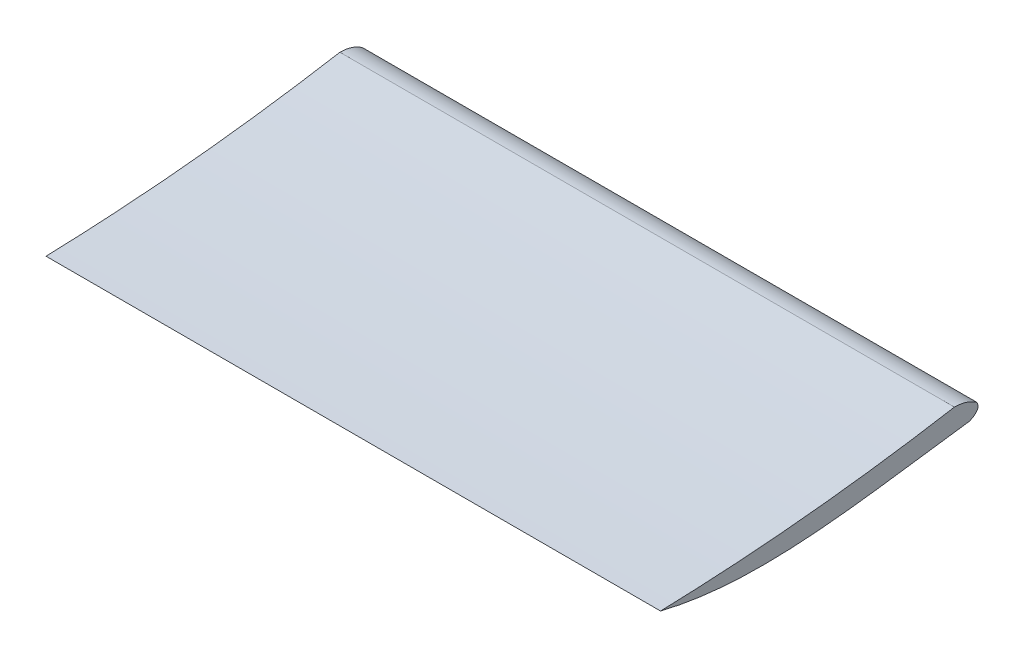
ISO-10303-21;
HEADER;
FILE_DESCRIPTION(('STEP AP214'),'2;1');
FILE_NAME('part.step','',(''),(''),'','','');
FILE_SCHEMA(('AUTOMOTIVE_DESIGN { 1 0 10303 214 1 1 1 1 }'));
ENDSEC;
DATA;
#1=APPLICATION_CONTEXT('core data for automotive mechanical design processes');
#2=APPLICATION_PROTOCOL_DEFINITION('international standard','automotive_design',2000,#1);
#3=PRODUCT_CONTEXT('',#1,'mechanical');
#4=PRODUCT('Part','Part','',(#3));
#5=PRODUCT_RELATED_PRODUCT_CATEGORY('part','',(#4));
#6=PRODUCT_DEFINITION_FORMATION('','',#4);
#7=PRODUCT_DEFINITION_CONTEXT('part definition',#1,'design');
#8=PRODUCT_DEFINITION('design','',#6,#7);
#9=PRODUCT_DEFINITION_SHAPE('','',#8);
#10=(LENGTH_UNIT() NAMED_UNIT(*) SI_UNIT(.MILLI.,.METRE.));
#11=(NAMED_UNIT(*) PLANE_ANGLE_UNIT() SI_UNIT($,.RADIAN.));
#12=(NAMED_UNIT(*) SI_UNIT($,.STERADIAN.) SOLID_ANGLE_UNIT());
#13=UNCERTAINTY_MEASURE_WITH_UNIT(LENGTH_MEASURE(1.E-05),#10,'distance_accuracy_value','');
#14=(GEOMETRIC_REPRESENTATION_CONTEXT(3) GLOBAL_UNCERTAINTY_ASSIGNED_CONTEXT((#13)) GLOBAL_UNIT_ASSIGNED_CONTEXT((#10,
#11,#12)) REPRESENTATION_CONTEXT('',''));
#15=CARTESIAN_POINT('',(0.,0.,0.));
#16=DIRECTION('',(0.,0.,1.));
#17=DIRECTION('',(1.,0.,0.));
#18=AXIS2_PLACEMENT_3D('',#15,#16,#17);
#19=CARTESIAN_POINT('',(203.2,-4.18495962632909,2.45981299652732));
#20=CARTESIAN_POINT('',(203.2,-2.57502478355309,-1.38630238398385));
#21=CARTESIAN_POINT('',(203.2,0.,0.));
#22=B_SPLINE_CURVE_WITH_KNOTS('',2,(#19,#20,#21),.UNSPECIFIED.,.F.,.F.,(3,3),(0.,1.),.UNSPECIFIED.);
#23=DIRECTION('',(-1.,0.,0.));
#24=VECTOR('',#23,1.);
#25=SURFACE_OF_LINEAR_EXTRUSION('',#22,#24);
#26=CARTESIAN_POINT('',(0.,-4.18495962632909,2.45981299652732));
#27=CARTESIAN_POINT('',(0.,-2.57502478355309,-1.38630238398385));
#28=CARTESIAN_POINT('',(0.,0.,0.));
#29=B_SPLINE_CURVE_WITH_KNOTS('',2,(#26,#27,#28),.UNSPECIFIED.,.F.,.F.,(3,3),(0.,1.),.UNSPECIFIED.);
#30=CARTESIAN_POINT('',(0.,-4.18495962632909,2.45981299652732));
#31=VERTEX_POINT('',#30);
#32=CARTESIAN_POINT('',(0.,0.,0.));
#33=VERTEX_POINT('',#32);
#34=EDGE_CURVE('E135',#31,#33,#29,.T.);
#35=ORIENTED_EDGE('',*,*,#34,.T.);
#36=DIRECTION('',(-1.,0.,0.));
#37=VECTOR('',#36,1.);
#38=CARTESIAN_POINT('',(203.2,0.,0.));
#39=LINE('',#38,#37);
#40=CARTESIAN_POINT('',(203.2,0.,0.));
#41=VERTEX_POINT('',#40);
#42=EDGE_CURVE('E11',#41,#33,#39,.T.);
#43=ORIENTED_EDGE('',*,*,#42,.F.);
#44=CARTESIAN_POINT('',(203.2,-4.18495962632909,2.45981299652732));
#45=VERTEX_POINT('',#44);
#46=EDGE_CURVE('E94',#45,#41,#22,.T.);
#47=ORIENTED_EDGE('',*,*,#46,.F.);
#48=DIRECTION('',(-1.,0.,0.));
#49=VECTOR('',#48,1.);
#50=CARTESIAN_POINT('',(203.2,-4.18495962632909,2.45981299652732));
#51=LINE('',#50,#49);
#52=EDGE_CURVE('E106',#45,#31,#51,.T.);
#53=ORIENTED_EDGE('',*,*,#52,.T.);
#54=EDGE_LOOP('',(#35,#43,#47,#53));
#55=FACE_BOUND('',#54,.T.);
#56=ADVANCED_FACE('F41',(#55),#25,.F.);
#57=CARTESIAN_POINT('',(203.2,0.,0.));
#58=CARTESIAN_POINT('',(203.2,2.31548553526896,3.30474719153974));
#59=CARTESIAN_POINT('',(203.2,2.35967513996288,7.43274098440942));
#60=B_SPLINE_CURVE_WITH_KNOTS('',2,(#57,#58,#59),.UNSPECIFIED.,.F.,.F.,(3,3),(0.,1.),.UNSPECIFIED.);
#61=DIRECTION('',(-1.,0.,0.));
#62=VECTOR('',#61,1.);
#63=SURFACE_OF_LINEAR_EXTRUSION('',#60,#62);
#64=CARTESIAN_POINT('',(0.,0.,0.));
#65=CARTESIAN_POINT('',(0.,2.31548553526896,3.30474719153974));
#66=CARTESIAN_POINT('',(0.,2.35967513996288,7.43274098440942));
#67=B_SPLINE_CURVE_WITH_KNOTS('',2,(#64,#65,#66),.UNSPECIFIED.,.F.,.F.,(3,3),(0.,1.),.UNSPECIFIED.);
#68=CARTESIAN_POINT('',(0.,2.35967513996288,7.43274098440942));
#69=VERTEX_POINT('',#68);
#70=EDGE_CURVE('E99',#33,#69,#67,.T.);
#71=ORIENTED_EDGE('',*,*,#70,.T.);
#72=DIRECTION('',(-1.,0.,0.));
#73=VECTOR('',#72,1.);
#74=CARTESIAN_POINT('',(203.2,2.35967513996288,7.43274098440942));
#75=LINE('',#74,#73);
#76=CARTESIAN_POINT('',(203.2,2.35967513996288,7.43274098440942));
#77=VERTEX_POINT('',#76);
#78=EDGE_CURVE('E51',#77,#69,#75,.T.);
#79=ORIENTED_EDGE('',*,*,#78,.F.);
#80=EDGE_CURVE('E89',#41,#77,#60,.T.);
#81=ORIENTED_EDGE('',*,*,#80,.F.);
#82=ORIENTED_EDGE('',*,*,#42,.T.);
#83=EDGE_LOOP('',(#71,#79,#81,#82));
#84=FACE_BOUND('',#83,.T.);
#85=ADVANCED_FACE('F98',(#84),#63,.F.);
#86=CARTESIAN_POINT('',(203.2,2.35967513996288,7.43274098440942));
#87=CARTESIAN_POINT('',(203.2,-5.99214234021373,55.6936201876919));
#88=CARTESIAN_POINT('',(203.2,-7.46181194267576,104.593481744103));
#89=B_SPLINE_CURVE_WITH_KNOTS('',2,(#86,#87,#88),.UNSPECIFIED.,.F.,.F.,(3,3),(0.,1.),.UNSPECIFIED.);
#90=DIRECTION('',(-1.,0.,0.));
#91=VECTOR('',#90,1.);
#92=SURFACE_OF_LINEAR_EXTRUSION('',#89,#91);
#93=CARTESIAN_POINT('',(0.,2.35967513996288,7.43274098440942));
#94=CARTESIAN_POINT('',(0.,-5.99214234021373,55.6936201876919));
#95=CARTESIAN_POINT('',(0.,-7.46181194267576,104.593481744103));
#96=B_SPLINE_CURVE_WITH_KNOTS('',2,(#93,#94,#95),.UNSPECIFIED.,.F.,.F.,(3,3),(0.,1.),.UNSPECIFIED.);
#97=CARTESIAN_POINT('',(0.,-7.46181194267576,104.593481744103));
#98=VERTEX_POINT('',#97);
#99=EDGE_CURVE('E76',#69,#98,#96,.T.);
#100=ORIENTED_EDGE('',*,*,#99,.T.);
#101=DIRECTION('',(-1.,0.,0.));
#102=VECTOR('',#101,1.);
#103=CARTESIAN_POINT('',(203.2,-7.46181194267576,104.593481744103));
#104=LINE('',#103,#102);
#105=CARTESIAN_POINT('',(203.2,-7.46181194267576,104.593481744103));
#106=VERTEX_POINT('',#105);
#107=EDGE_CURVE('E101',#106,#98,#104,.T.);
#108=ORIENTED_EDGE('',*,*,#107,.F.);
#109=EDGE_CURVE('E92',#77,#106,#89,.T.);
#110=ORIENTED_EDGE('',*,*,#109,.F.);
#111=ORIENTED_EDGE('',*,*,#78,.T.);
#112=EDGE_LOOP('',(#100,#108,#110,#111));
#113=FACE_BOUND('',#112,.T.);
#114=ADVANCED_FACE('F102',(#113),#92,.F.);
#115=CARTESIAN_POINT('',(203.2,-7.46181194267576,104.593481744103));
#116=CARTESIAN_POINT('',(203.2,-15.848405968362,70.5594192615226));
#117=CARTESIAN_POINT('',(203.2,-8.45037234066362,36.2197655586999));
#118=CARTESIAN_POINT('',(203.2,-4.18495962632909,2.45981299652732));
#119=B_SPLINE_CURVE_WITH_KNOTS('',3,(#115,#116,#117,#118),.UNSPECIFIED.,.F.,.F.,(4,4),(0.,1.),.UNSPECIFIED.);
#120=DIRECTION('',(-1.,0.,0.));
#121=VECTOR('',#120,1.);
#122=SURFACE_OF_LINEAR_EXTRUSION('',#119,#121);
#123=CARTESIAN_POINT('',(0.,-7.46181194267576,104.593481744103));
#124=CARTESIAN_POINT('',(0.,-15.848405968362,70.5594192615226));
#125=CARTESIAN_POINT('',(0.,-8.45037234066362,36.2197655586999));
#126=CARTESIAN_POINT('',(0.,-4.18495962632909,2.45981299652732));
#127=B_SPLINE_CURVE_WITH_KNOTS('',3,(#123,#124,#125,#126),.UNSPECIFIED.,.F.,.F.,(4,4),(0.,1.),.UNSPECIFIED.);
#128=EDGE_CURVE('E82',#98,#31,#127,.T.);
#129=ORIENTED_EDGE('',*,*,#128,.T.);
#130=ORIENTED_EDGE('',*,*,#52,.F.);
#131=EDGE_CURVE('E59',#106,#45,#119,.T.);
#132=ORIENTED_EDGE('',*,*,#131,.F.);
#133=ORIENTED_EDGE('',*,*,#107,.T.);
#134=EDGE_LOOP('',(#129,#130,#132,#133));
#135=FACE_BOUND('',#134,.T.);
#136=ADVANCED_FACE('F124',(#135),#122,.F.);
#137=CARTESIAN_POINT('',(203.2,-2.33375229835882,-0.078197942860095));
#138=DIRECTION('',(-1.,0.,0.));
#139=DIRECTION('',(0.,0.,1.));
#140=AXIS2_PLACEMENT_3D('',#137,#138,#139);
#141=PLANE('',#140);
#142=ORIENTED_EDGE('',*,*,#46,.T.);
#143=ORIENTED_EDGE('',*,*,#80,.T.);
#144=ORIENTED_EDGE('',*,*,#109,.T.);
#145=ORIENTED_EDGE('',*,*,#131,.T.);
#146=EDGE_LOOP('',(#142,#143,#144,#145));
#147=FACE_BOUND('',#146,.T.);
#148=ADVANCED_FACE('F90',(#147),#141,.F.);
#149=CARTESIAN_POINT('',(0.,-2.33375229835882,-0.078197942860095));
#150=DIRECTION('',(-1.,0.,0.));
#151=DIRECTION('',(0.,0.,1.));
#152=AXIS2_PLACEMENT_3D('',#149,#150,#151);
#153=PLANE('',#152);
#154=ORIENTED_EDGE('',*,*,#34,.F.);
#155=ORIENTED_EDGE('',*,*,#128,.F.);
#156=ORIENTED_EDGE('',*,*,#99,.F.);
#157=ORIENTED_EDGE('',*,*,#70,.F.);
#158=EDGE_LOOP('',(#154,#155,#156,#157));
#159=FACE_BOUND('',#158,.T.);
#160=ADVANCED_FACE('F168',(#159),#153,.T.);
#161=CLOSED_SHELL('',(#56,#85,#114,#136,#148,#160));
#162=MANIFOLD_SOLID_BREP('B2',#161);
#163=ADVANCED_BREP_SHAPE_REPRESENTATION('',(#18,#162),#14);
#164=SHAPE_DEFINITION_REPRESENTATION(#9,#163);
ENDSEC;
END-ISO-10303-21;
